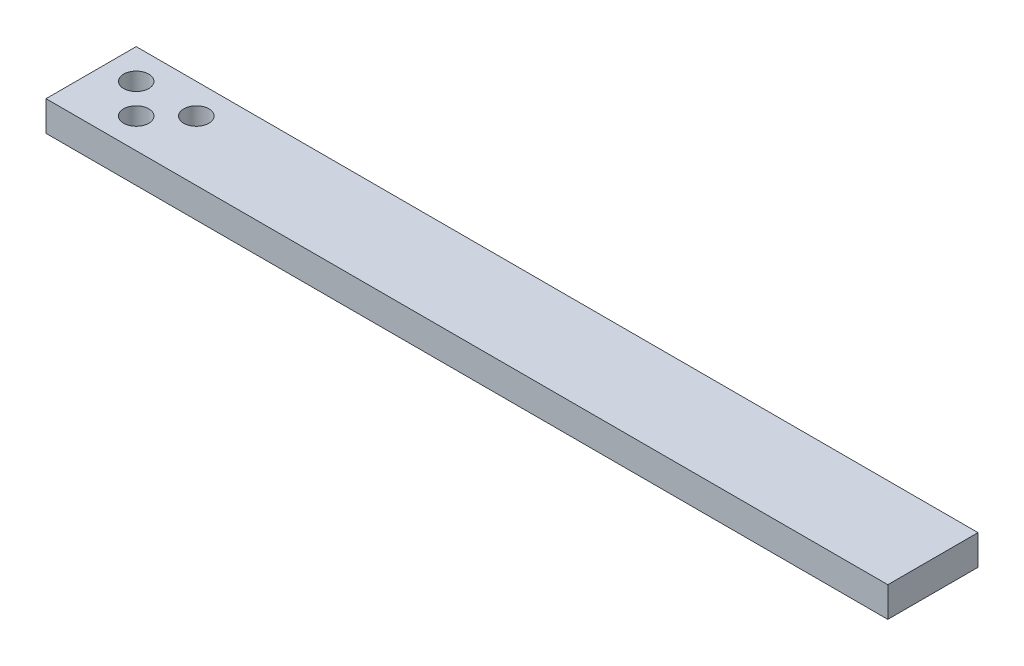
ISO-10303-21;
HEADER;
FILE_DESCRIPTION(('STEP AP214'),'2;1');
FILE_NAME('part.step','',(''),(''),'','','');
FILE_SCHEMA(('AUTOMOTIVE_DESIGN { 1 0 10303 214 1 1 1 1 }'));
ENDSEC;
DATA;
#1=APPLICATION_CONTEXT('core data for automotive mechanical design processes');
#2=APPLICATION_PROTOCOL_DEFINITION('international standard','automotive_design',2000,#1);
#3=PRODUCT_CONTEXT('',#1,'mechanical');
#4=PRODUCT('Part','Part','',(#3));
#5=PRODUCT_RELATED_PRODUCT_CATEGORY('part','',(#4));
#6=PRODUCT_DEFINITION_FORMATION('','',#4);
#7=PRODUCT_DEFINITION_CONTEXT('part definition',#1,'design');
#8=PRODUCT_DEFINITION('design','',#6,#7);
#9=PRODUCT_DEFINITION_SHAPE('','',#8);
#10=(LENGTH_UNIT() NAMED_UNIT(*) SI_UNIT(.MILLI.,.METRE.));
#11=(NAMED_UNIT(*) PLANE_ANGLE_UNIT() SI_UNIT($,.RADIAN.));
#12=(NAMED_UNIT(*) SI_UNIT($,.STERADIAN.) SOLID_ANGLE_UNIT());
#13=UNCERTAINTY_MEASURE_WITH_UNIT(LENGTH_MEASURE(1.E-05),#10,'distance_accuracy_value','');
#14=(GEOMETRIC_REPRESENTATION_CONTEXT(3) GLOBAL_UNCERTAINTY_ASSIGNED_CONTEXT((#13)) GLOBAL_UNIT_ASSIGNED_CONTEXT((#10,
#11,#12)) REPRESENTATION_CONTEXT('',''));
#15=CARTESIAN_POINT('',(0.,0.,0.));
#16=DIRECTION('',(0.,0.,1.));
#17=DIRECTION('',(1.,0.,0.));
#18=AXIS2_PLACEMENT_3D('',#15,#16,#17);
#19=CARTESIAN_POINT('',(0.,6.35,0.));
#20=DIRECTION('',(1.,0.,0.));
#21=DIRECTION('',(0.,0.,-1.));
#22=AXIS2_PLACEMENT_3D('',#19,#20,#21);
#23=PLANE('',#22);
#24=DIRECTION('',(0.,0.,1.));
#25=VECTOR('',#24,1.);
#26=CARTESIAN_POINT('',(0.,0.,0.));
#27=LINE('',#26,#25);
#28=CARTESIAN_POINT('',(0.,0.,-19.05));
#29=VERTEX_POINT('',#28);
#30=CARTESIAN_POINT('',(0.,0.,0.));
#31=VERTEX_POINT('',#30);
#32=EDGE_CURVE('E109',#29,#31,#27,.T.);
#33=ORIENTED_EDGE('',*,*,#32,.T.);
#34=DIRECTION('',(0.,-1.,0.));
#35=VECTOR('',#34,1.);
#36=CARTESIAN_POINT('',(0.,6.35,0.));
#37=LINE('',#36,#35);
#38=CARTESIAN_POINT('',(0.,6.35,0.));
#39=VERTEX_POINT('',#38);
#40=EDGE_CURVE('E11',#39,#31,#37,.T.);
#41=ORIENTED_EDGE('',*,*,#40,.F.);
#42=DIRECTION('',(0.,0.,1.));
#43=VECTOR('',#42,1.);
#44=CARTESIAN_POINT('',(0.,6.35,0.));
#45=LINE('',#44,#43);
#46=CARTESIAN_POINT('',(0.,6.35,-19.05));
#47=VERTEX_POINT('',#46);
#48=EDGE_CURVE('E92',#47,#39,#45,.T.);
#49=ORIENTED_EDGE('',*,*,#48,.F.);
#50=DIRECTION('',(0.,-1.,0.));
#51=VECTOR('',#50,1.);
#52=CARTESIAN_POINT('',(0.,6.35,-19.05));
#53=LINE('',#52,#51);
#54=EDGE_CURVE('E105',#47,#29,#53,.T.);
#55=ORIENTED_EDGE('',*,*,#54,.T.);
#56=EDGE_LOOP('',(#33,#41,#49,#55));
#57=FACE_BOUND('',#56,.T.);
#58=ADVANCED_FACE('F39',(#57),#23,.F.);
#59=CARTESIAN_POINT('',(0.,6.35,0.));
#60=DIRECTION('',(0.,0.,-1.));
#61=DIRECTION('',(-1.,0.,0.));
#62=AXIS2_PLACEMENT_3D('',#59,#60,#61);
#63=PLANE('',#62);
#64=DIRECTION('',(1.,0.,0.));
#65=VECTOR('',#64,1.);
#66=CARTESIAN_POINT('',(0.,0.,0.));
#67=LINE('',#66,#65);
#68=CARTESIAN_POINT('',(177.8,0.,0.));
#69=VERTEX_POINT('',#68);
#70=EDGE_CURVE('E97',#31,#69,#67,.T.);
#71=ORIENTED_EDGE('',*,*,#70,.T.);
#72=DIRECTION('',(0.,-1.,0.));
#73=VECTOR('',#72,1.);
#74=CARTESIAN_POINT('',(177.8,6.35,0.));
#75=LINE('',#74,#73);
#76=CARTESIAN_POINT('',(177.8,6.35,0.));
#77=VERTEX_POINT('',#76);
#78=EDGE_CURVE('E49',#77,#69,#75,.T.);
#79=ORIENTED_EDGE('',*,*,#78,.F.);
#80=DIRECTION('',(1.,0.,0.));
#81=VECTOR('',#80,1.);
#82=CARTESIAN_POINT('',(0.,6.35,0.));
#83=LINE('',#82,#81);
#84=EDGE_CURVE('E87',#39,#77,#83,.T.);
#85=ORIENTED_EDGE('',*,*,#84,.F.);
#86=ORIENTED_EDGE('',*,*,#40,.T.);
#87=EDGE_LOOP('',(#71,#79,#85,#86));
#88=FACE_BOUND('',#87,.T.);
#89=ADVANCED_FACE('F96',(#88),#63,.F.);
#90=CARTESIAN_POINT('',(177.8,6.35,0.));
#91=DIRECTION('',(-1.,0.,0.));
#92=DIRECTION('',(0.,0.,1.));
#93=AXIS2_PLACEMENT_3D('',#90,#91,#92);
#94=PLANE('',#93);
#95=DIRECTION('',(0.,0.,-1.));
#96=VECTOR('',#95,1.);
#97=CARTESIAN_POINT('',(177.8,0.,0.));
#98=LINE('',#97,#96);
#99=CARTESIAN_POINT('',(177.8,0.,-19.05));
#100=VERTEX_POINT('',#99);
#101=EDGE_CURVE('E74',#69,#100,#98,.T.);
#102=ORIENTED_EDGE('',*,*,#101,.T.);
#103=DIRECTION('',(0.,-1.,0.));
#104=VECTOR('',#103,1.);
#105=CARTESIAN_POINT('',(177.8,6.35,-19.05));
#106=LINE('',#105,#104);
#107=CARTESIAN_POINT('',(177.8,6.35,-19.05));
#108=VERTEX_POINT('',#107);
#109=EDGE_CURVE('E99',#108,#100,#106,.T.);
#110=ORIENTED_EDGE('',*,*,#109,.F.);
#111=DIRECTION('',(0.,0.,-1.));
#112=VECTOR('',#111,1.);
#113=CARTESIAN_POINT('',(177.8,6.35,0.));
#114=LINE('',#113,#112);
#115=EDGE_CURVE('E90',#77,#108,#114,.T.);
#116=ORIENTED_EDGE('',*,*,#115,.F.);
#117=ORIENTED_EDGE('',*,*,#78,.T.);
#118=EDGE_LOOP('',(#102,#110,#116,#117));
#119=FACE_BOUND('',#118,.T.);
#120=ADVANCED_FACE('F101',(#119),#94,.F.);
#121=CARTESIAN_POINT('',(0.,6.35,-19.05));
#122=DIRECTION('',(0.,0.,1.));
#123=DIRECTION('',(1.,0.,0.));
#124=AXIS2_PLACEMENT_3D('',#121,#122,#123);
#125=PLANE('',#124);
#126=DIRECTION('',(-1.,0.,0.));
#127=VECTOR('',#126,1.);
#128=CARTESIAN_POINT('',(0.,0.,-19.05));
#129=LINE('',#128,#127);
#130=EDGE_CURVE('E80',#100,#29,#129,.T.);
#131=ORIENTED_EDGE('',*,*,#130,.T.);
#132=ORIENTED_EDGE('',*,*,#54,.F.);
#133=DIRECTION('',(-1.,0.,0.));
#134=VECTOR('',#133,1.);
#135=CARTESIAN_POINT('',(0.,6.35,-19.05));
#136=LINE('',#135,#134);
#137=EDGE_CURVE('E57',#108,#47,#136,.T.);
#138=ORIENTED_EDGE('',*,*,#137,.F.);
#139=ORIENTED_EDGE('',*,*,#109,.T.);
#140=EDGE_LOOP('',(#131,#132,#138,#139));
#141=FACE_BOUND('',#140,.T.);
#142=ADVANCED_FACE('F123',(#141),#125,.F.);
#143=CARTESIAN_POINT('',(0.,6.35,0.));
#144=DIRECTION('',(0.,-1.,0.));
#145=DIRECTION('',(0.,0.,-1.));
#146=AXIS2_PLACEMENT_3D('',#143,#144,#145);
#147=PLANE('',#146);
#148=CARTESIAN_POINT('',(6.35,6.35,-12.7));
#149=DIRECTION('',(0.,1.,0.));
#150=DIRECTION('',(0.,0.,1.));
#151=AXIS2_PLACEMENT_3D('',#148,#149,#150);
#152=CIRCLE('',#151,2.6543);
#153=CARTESIAN_POINT('',(6.35,6.35,-10.0457));
#154=VERTEX_POINT('',#153);
#155=EDGE_CURVE('E145',#154,#154,#152,.T.);
#156=ORIENTED_EDGE('',*,*,#155,.F.);
#157=EDGE_LOOP('',(#156));
#158=FACE_BOUND('',#157,.T.);
#159=CARTESIAN_POINT('',(19.05,6.35,-12.7));
#160=DIRECTION('',(0.,1.,0.));
#161=DIRECTION('',(0.,0.,1.));
#162=AXIS2_PLACEMENT_3D('',#159,#160,#161);
#163=CIRCLE('',#162,2.6543);
#164=CARTESIAN_POINT('',(19.05,6.35,-10.0457));
#165=VERTEX_POINT('',#164);
#166=EDGE_CURVE('E137',#165,#165,#163,.T.);
#167=ORIENTED_EDGE('',*,*,#166,.F.);
#168=EDGE_LOOP('',(#167));
#169=FACE_BOUND('',#168,.T.);
#170=CARTESIAN_POINT('',(12.7,6.35,-6.35));
#171=DIRECTION('',(0.,1.,0.));
#172=DIRECTION('',(0.,0.,1.));
#173=AXIS2_PLACEMENT_3D('',#170,#171,#172);
#174=CIRCLE('',#173,2.6543);
#175=CARTESIAN_POINT('',(12.7,6.35,-3.6957));
#176=VERTEX_POINT('',#175);
#177=EDGE_CURVE('E133',#176,#176,#174,.T.);
#178=ORIENTED_EDGE('',*,*,#177,.F.);
#179=EDGE_LOOP('',(#178));
#180=FACE_BOUND('',#179,.T.);
#181=ORIENTED_EDGE('',*,*,#48,.T.);
#182=ORIENTED_EDGE('',*,*,#84,.T.);
#183=ORIENTED_EDGE('',*,*,#115,.T.);
#184=ORIENTED_EDGE('',*,*,#137,.T.);
#185=EDGE_LOOP('',(#181,#182,#183,#184));
#186=FACE_BOUND('',#185,.T.);
#187=ADVANCED_FACE('F88',(#158,#169,#180,#186),#147,.F.);
#188=CARTESIAN_POINT('',(0.,0.,0.));
#189=DIRECTION('',(0.,-1.,0.));
#190=DIRECTION('',(0.,0.,-1.));
#191=AXIS2_PLACEMENT_3D('',#188,#189,#190);
#192=PLANE('',#191);
#193=CARTESIAN_POINT('',(6.35,0.,-12.7));
#194=DIRECTION('',(0.,-1.,0.));
#195=DIRECTION('',(0.,0.,-1.));
#196=AXIS2_PLACEMENT_3D('',#193,#194,#195);
#197=CIRCLE('',#196,2.6543);
#198=CARTESIAN_POINT('',(6.35,0.,-15.3543));
#199=VERTEX_POINT('',#198);
#200=EDGE_CURVE('E141',#199,#199,#197,.T.);
#201=ORIENTED_EDGE('',*,*,#200,.F.);
#202=EDGE_LOOP('',(#201));
#203=FACE_BOUND('',#202,.T.);
#204=CARTESIAN_POINT('',(19.05,0.,-12.7));
#205=DIRECTION('',(0.,-1.,0.));
#206=DIRECTION('',(0.,0.,-1.));
#207=AXIS2_PLACEMENT_3D('',#204,#205,#206);
#208=CIRCLE('',#207,2.6543);
#209=CARTESIAN_POINT('',(19.05,0.,-15.3543));
#210=VERTEX_POINT('',#209);
#211=EDGE_CURVE('E42',#210,#210,#208,.T.);
#212=ORIENTED_EDGE('',*,*,#211,.F.);
#213=EDGE_LOOP('',(#212));
#214=FACE_BOUND('',#213,.T.);
#215=CARTESIAN_POINT('',(12.7,0.,-6.35));
#216=DIRECTION('',(0.,-1.,0.));
#217=DIRECTION('',(0.,0.,-1.));
#218=AXIS2_PLACEMENT_3D('',#215,#216,#217);
#219=CIRCLE('',#218,2.6543);
#220=CARTESIAN_POINT('',(12.7,0.,-9.0043));
#221=VERTEX_POINT('',#220);
#222=EDGE_CURVE('E113',#221,#221,#219,.T.);
#223=ORIENTED_EDGE('',*,*,#222,.F.);
#224=EDGE_LOOP('',(#223));
#225=FACE_BOUND('',#224,.T.);
#226=ORIENTED_EDGE('',*,*,#32,.F.);
#227=ORIENTED_EDGE('',*,*,#130,.F.);
#228=ORIENTED_EDGE('',*,*,#101,.F.);
#229=ORIENTED_EDGE('',*,*,#70,.F.);
#230=EDGE_LOOP('',(#226,#227,#228,#229));
#231=FACE_BOUND('',#230,.T.);
#232=ADVANCED_FACE('F126',(#203,#214,#225,#231),#192,.T.);
#233=CARTESIAN_POINT('',(12.7,6.35,-6.35));
#234=DIRECTION('',(0.,1.,0.));
#235=DIRECTION('',(0.,0.,1.));
#236=AXIS2_PLACEMENT_3D('',#233,#234,#235);
#237=CYLINDRICAL_SURFACE('',#236,2.6543);
#238=ORIENTED_EDGE('',*,*,#222,.T.);
#239=EDGE_LOOP('',(#238));
#240=FACE_BOUND('',#239,.T.);
#241=ORIENTED_EDGE('',*,*,#177,.T.);
#242=EDGE_LOOP('',(#241));
#243=FACE_BOUND('',#242,.T.);
#244=ADVANCED_FACE('F159',(#240,#243),#237,.F.);
#245=CARTESIAN_POINT('',(19.05,6.35,-12.7));
#246=DIRECTION('',(0.,1.,0.));
#247=DIRECTION('',(0.,0.,1.));
#248=AXIS2_PLACEMENT_3D('',#245,#246,#247);
#249=CYLINDRICAL_SURFACE('',#248,2.6543);
#250=ORIENTED_EDGE('',*,*,#211,.T.);
#251=EDGE_LOOP('',(#250));
#252=FACE_BOUND('',#251,.T.);
#253=ORIENTED_EDGE('',*,*,#166,.T.);
#254=EDGE_LOOP('',(#253));
#255=FACE_BOUND('',#254,.T.);
#256=ADVANCED_FACE('F161',(#252,#255),#249,.F.);
#257=CARTESIAN_POINT('',(6.35,6.35,-12.7));
#258=DIRECTION('',(0.,1.,0.));
#259=DIRECTION('',(0.,0.,1.));
#260=AXIS2_PLACEMENT_3D('',#257,#258,#259);
#261=CYLINDRICAL_SURFACE('',#260,2.6543);
#262=ORIENTED_EDGE('',*,*,#200,.T.);
#263=EDGE_LOOP('',(#262));
#264=FACE_BOUND('',#263,.T.);
#265=ORIENTED_EDGE('',*,*,#155,.T.);
#266=EDGE_LOOP('',(#265));
#267=FACE_BOUND('',#266,.T.);
#268=ADVANCED_FACE('F150',(#264,#267),#261,.F.);
#269=CLOSED_SHELL('',(#58,#89,#120,#142,#187,#232,#244,#256,#268));
#270=MANIFOLD_SOLID_BREP('B2',#269);
#271=ADVANCED_BREP_SHAPE_REPRESENTATION('',(#18,#270),#14);
#272=SHAPE_DEFINITION_REPRESENTATION(#9,#271);
ENDSEC;
END-ISO-10303-21;
